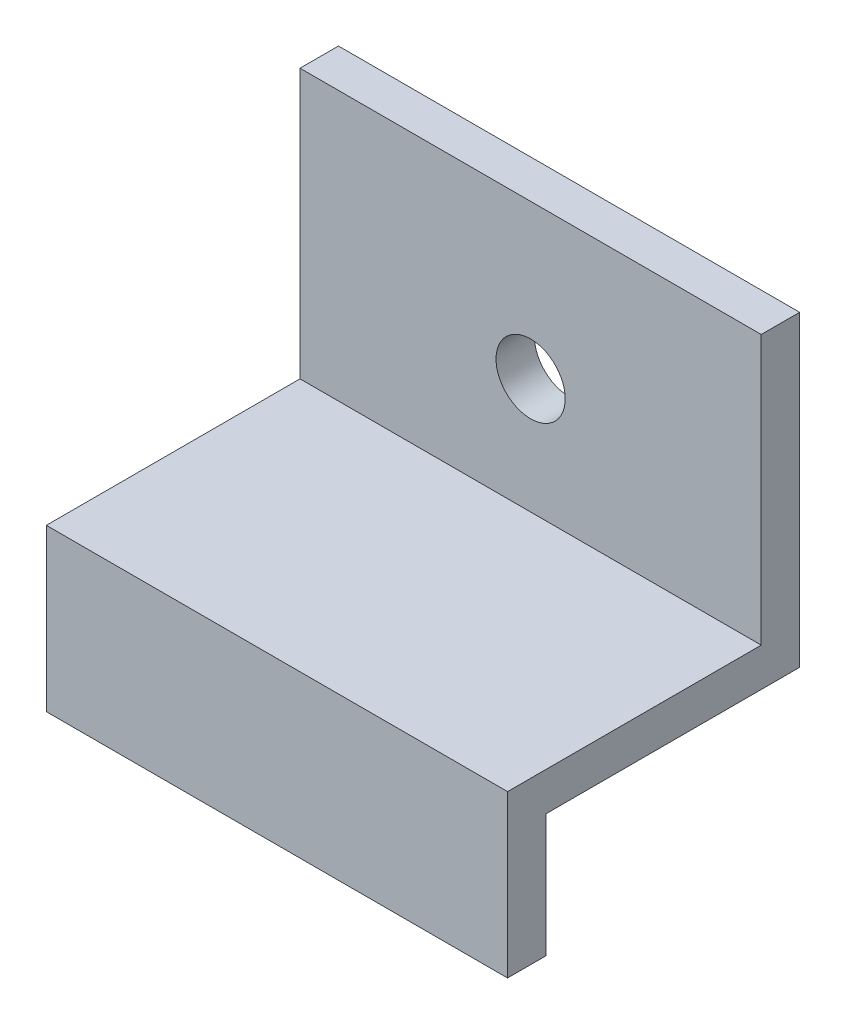
ISO-10303-21;
HEADER;
FILE_DESCRIPTION(('STEP AP214'),'2;1');
FILE_NAME('part.step','',(''),(''),'','','');
FILE_SCHEMA(('AUTOMOTIVE_DESIGN { 1 0 10303 214 1 1 1 1 }'));
ENDSEC;
DATA;
#1=APPLICATION_CONTEXT('core data for automotive mechanical design processes');
#2=APPLICATION_PROTOCOL_DEFINITION('international standard','automotive_design',2000,#1);
#3=PRODUCT_CONTEXT('',#1,'mechanical');
#4=PRODUCT('Part','Part','',(#3));
#5=PRODUCT_RELATED_PRODUCT_CATEGORY('part','',(#4));
#6=PRODUCT_DEFINITION_FORMATION('','',#4);
#7=PRODUCT_DEFINITION_CONTEXT('part definition',#1,'design');
#8=PRODUCT_DEFINITION('design','',#6,#7);
#9=PRODUCT_DEFINITION_SHAPE('','',#8);
#10=(LENGTH_UNIT() NAMED_UNIT(*) SI_UNIT(.MILLI.,.METRE.));
#11=(NAMED_UNIT(*) PLANE_ANGLE_UNIT() SI_UNIT($,.RADIAN.));
#12=(NAMED_UNIT(*) SI_UNIT($,.STERADIAN.) SOLID_ANGLE_UNIT());
#13=UNCERTAINTY_MEASURE_WITH_UNIT(LENGTH_MEASURE(1.E-05),#10,'distance_accuracy_value','');
#14=(GEOMETRIC_REPRESENTATION_CONTEXT(3) GLOBAL_UNCERTAINTY_ASSIGNED_CONTEXT((#13)) GLOBAL_UNIT_ASSIGNED_CONTEXT((#10,
#11,#12)) REPRESENTATION_CONTEXT('',''));
#15=CARTESIAN_POINT('',(0.,0.,0.));
#16=DIRECTION('',(0.,0.,1.));
#17=DIRECTION('',(1.,0.,0.));
#18=AXIS2_PLACEMENT_3D('',#15,#16,#17);
#19=CARTESIAN_POINT('',(-30.00000000005,46.,4.274625098333E-10));
#20=DIRECTION('',(0.,-1.,0.));
#21=DIRECTION('',(-1.,0.,0.));
#22=AXIS2_PLACEMENT_3D('',#19,#20,#21);
#23=PLANE('',#22);
#24=DIRECTION('',(1.,0.,-4.806710585115E-13));
#25=VECTOR('',#24,1.);
#26=CARTESIAN_POINT('',(-30.00000000005,46.,4.274625098333E-10));
#27=LINE('',#26,#25);
#28=CARTESIAN_POINT('',(-30.00000000005,46.,4.274625098333E-10));
#29=VERTEX_POINT('',#28);
#30=CARTESIAN_POINT('',(30.000000000126,46.,-4.029061528854E-10));
#31=VERTEX_POINT('',#30);
#32=EDGE_CURVE('E11',#29,#31,#27,.T.);
#33=ORIENTED_EDGE('',*,*,#32,.F.);
#34=DIRECTION('',(4.806710585115E-13,0.,1.));
#35=VECTOR('',#34,1.);
#36=CARTESIAN_POINT('',(-30.00000000005,46.,4.274625098333E-10));
#37=LINE('',#36,#35);
#38=CARTESIAN_POINT('',(-29.99999999994,46.,4.999999999994));
#39=VERTEX_POINT('',#38);
#40=EDGE_CURVE('E112',#29,#39,#37,.T.);
#41=ORIENTED_EDGE('',*,*,#40,.T.);
#42=DIRECTION('',(1.,0.,-4.806710585115E-13));
#43=VECTOR('',#42,1.);
#44=CARTESIAN_POINT('',(-29.99999999994,46.,4.999999999995));
#45=LINE('',#44,#43);
#46=CARTESIAN_POINT('',(29.99999999997,46.,5.000000000129));
#47=VERTEX_POINT('',#46);
#48=EDGE_CURVE('E162',#39,#47,#45,.T.);
#49=ORIENTED_EDGE('',*,*,#48,.T.);
#50=DIRECTION('',(4.806710585115E-13,0.,1.));
#51=VECTOR('',#50,1.);
#52=CARTESIAN_POINT('',(30.000000000126,46.,-4.033609002363E-10));
#53=LINE('',#52,#51);
#54=EDGE_CURVE('E113',#31,#47,#53,.T.);
#55=ORIENTED_EDGE('',*,*,#54,.F.);
#56=EDGE_LOOP('',(#33,#41,#49,#55));
#57=FACE_BOUND('',#56,.T.);
#58=ADVANCED_FACE('F17',(#57),#23,.F.);
#59=CARTESIAN_POINT('',(-30.00000000005,46.,4.274625098333E-10));
#60=DIRECTION('',(4.806710585115E-13,0.,1.));
#61=DIRECTION('',(1.,0.,-4.806710585115E-13));
#62=AXIS2_PLACEMENT_3D('',#59,#60,#61);
#63=PLANE('',#62);
#64=CARTESIAN_POINT('',(2.149818101316E-10,26.,-4.579305823427E-10));
#65=DIRECTION('',(4.806710585115E-13,0.,1.));
#66=DIRECTION('',(1.,0.,-4.806710585115E-13));
#67=AXIS2_PLACEMENT_3D('',#64,#65,#66);
#68=CIRCLE('',#67,4.5);
#69=CARTESIAN_POINT('',(4.499999999965,26.,4.711182555184E-10));
#70=VERTEX_POINT('',#69);
#71=EDGE_CURVE('E142',#70,#70,#68,.T.);
#72=ORIENTED_EDGE('',*,*,#71,.T.);
#73=EDGE_LOOP('',(#72));
#74=FACE_BOUND('',#73,.T.);
#75=DIRECTION('',(0.,-1.,0.));
#76=VECTOR('',#75,1.);
#77=CARTESIAN_POINT('',(-30.00000000005,46.,4.274625098333E-10));
#78=LINE('',#77,#76);
#79=CARTESIAN_POINT('',(-30.00000000005,6.,4.274625098333E-10));
#80=VERTEX_POINT('',#79);
#81=EDGE_CURVE('E116',#29,#80,#78,.T.);
#82=ORIENTED_EDGE('',*,*,#81,.F.);
#83=ORIENTED_EDGE('',*,*,#32,.T.);
#84=DIRECTION('',(0.,-1.,0.));
#85=VECTOR('',#84,1.);
#86=CARTESIAN_POINT('',(30.000000000126,46.,-4.033609002363E-10));
#87=LINE('',#86,#85);
#88=CARTESIAN_POINT('',(30.000000000126,6.,-4.029061528854E-10));
#89=VERTEX_POINT('',#88);
#90=EDGE_CURVE('E179',#31,#89,#87,.T.);
#91=ORIENTED_EDGE('',*,*,#90,.T.);
#92=DIRECTION('',(1.,0.,-4.806710585115E-13));
#93=VECTOR('',#92,1.);
#94=CARTESIAN_POINT('',(-30.00000000005,6.,4.274625098333E-10));
#95=LINE('',#94,#93);
#96=EDGE_CURVE('E20',#80,#89,#95,.T.);
#97=ORIENTED_EDGE('',*,*,#96,.F.);
#98=EDGE_LOOP('',(#82,#83,#91,#97));
#99=FACE_BOUND('',#98,.T.);
#100=ADVANCED_FACE('F117',(#74,#99),#63,.F.);
#101=CARTESIAN_POINT('',(-30.00000000005,6.,4.273488229956E-10));
#102=DIRECTION('',(0.,-1.,0.));
#103=DIRECTION('',(-1.,0.,0.));
#104=AXIS2_PLACEMENT_3D('',#101,#102,#103);
#105=PLANE('',#104);
#106=DIRECTION('',(6.57315868402E-12,0.,-1.));
#107=VECTOR('',#106,1.);
#108=CARTESIAN_POINT('',(29.999999999909,6.,33.000000000452));
#109=LINE('',#108,#107);
#110=CARTESIAN_POINT('',(29.999999999909,6.,33.000000000452));
#111=VERTEX_POINT('',#110);
#112=EDGE_CURVE('E139',#111,#89,#109,.T.);
#113=ORIENTED_EDGE('',*,*,#112,.F.);
#114=DIRECTION('',(1.,0.,-4.806710585115E-13));
#115=VECTOR('',#114,1.);
#116=CARTESIAN_POINT('',(-30.00000000001,6.,33.000000000317));
#117=LINE('',#116,#115);
#118=CARTESIAN_POINT('',(-30.00000000001,6.,33.000000000317));
#119=VERTEX_POINT('',#118);
#120=EDGE_CURVE('E205',#119,#111,#117,.T.);
#121=ORIENTED_EDGE('',*,*,#120,.F.);
#122=DIRECTION('',(-1.260852533491E-12,0.,-1.));
#123=VECTOR('',#122,1.);
#124=CARTESIAN_POINT('',(-30.00000000001,6.,33.000000000317));
#125=LINE('',#124,#123);
#126=EDGE_CURVE('E121',#119,#80,#125,.T.);
#127=ORIENTED_EDGE('',*,*,#126,.T.);
#128=ORIENTED_EDGE('',*,*,#96,.T.);
#129=EDGE_LOOP('',(#113,#121,#127,#128));
#130=FACE_BOUND('',#129,.T.);
#131=ADVANCED_FACE('F272',(#130),#105,.T.);
#132=CARTESIAN_POINT('',(-30.00000000001,11.,33.000000000317));
#133=DIRECTION('',(4.806710585115E-13,0.,1.));
#134=DIRECTION('',(1.,0.,-4.806710585115E-13));
#135=AXIS2_PLACEMENT_3D('',#132,#133,#134);
#136=PLANE('',#135);
#137=DIRECTION('',(0.,-1.,0.));
#138=VECTOR('',#137,1.);
#139=CARTESIAN_POINT('',(-30.00000000001,11.,33.000000000317));
#140=LINE('',#139,#138);
#141=CARTESIAN_POINT('',(-30.00000000001,-10.,33.000000000317));
#142=VERTEX_POINT('',#141);
#143=EDGE_CURVE('E149',#119,#142,#140,.T.);
#144=ORIENTED_EDGE('',*,*,#143,.F.);
#145=ORIENTED_EDGE('',*,*,#120,.T.);
#146=DIRECTION('',(0.,-1.,0.));
#147=VECTOR('',#146,1.);
#148=CARTESIAN_POINT('',(29.999999999909,11.,33.000000000452));
#149=LINE('',#148,#147);
#150=CARTESIAN_POINT('',(29.999999999909,-10.,33.000000000452));
#151=VERTEX_POINT('',#150);
#152=EDGE_CURVE('E137',#111,#151,#149,.T.);
#153=ORIENTED_EDGE('',*,*,#152,.T.);
#154=DIRECTION('',(1.,0.,-4.806710585115E-13));
#155=VECTOR('',#154,1.);
#156=CARTESIAN_POINT('',(-30.00000000001,-10.,33.000000000317));
#157=LINE('',#156,#155);
#158=EDGE_CURVE('E191',#142,#151,#157,.T.);
#159=ORIENTED_EDGE('',*,*,#158,.F.);
#160=EDGE_LOOP('',(#144,#145,#153,#159));
#161=FACE_BOUND('',#160,.T.);
#162=ADVANCED_FACE('F258',(#161),#136,.F.);
#163=CARTESIAN_POINT('',(-30.00000000001,-10.,33.000000000317));
#164=DIRECTION('',(0.,-1.,0.));
#165=DIRECTION('',(-1.,0.,0.));
#166=AXIS2_PLACEMENT_3D('',#163,#164,#165);
#167=PLANE('',#166);
#168=DIRECTION('',(4.806710585115E-13,0.,1.));
#169=VECTOR('',#168,1.);
#170=CARTESIAN_POINT('',(29.999999999909,-10.,33.000000000452));
#171=LINE('',#170,#169);
#172=CARTESIAN_POINT('',(30.000000000012,-10.,38.000000000019));
#173=VERTEX_POINT('',#172);
#174=EDGE_CURVE('E140',#151,#173,#171,.T.);
#175=ORIENTED_EDGE('',*,*,#174,.T.);
#176=DIRECTION('',(1.,0.,-4.806710585115E-13));
#177=VECTOR('',#176,1.);
#178=CARTESIAN_POINT('',(-29.9999999999,-10.,37.999999999884));
#179=LINE('',#178,#177);
#180=CARTESIAN_POINT('',(-29.9999999999,-10.,37.999999999884));
#181=VERTEX_POINT('',#180);
#182=EDGE_CURVE('E188',#181,#173,#179,.T.);
#183=ORIENTED_EDGE('',*,*,#182,.F.);
#184=DIRECTION('',(4.806710585115E-13,0.,1.));
#185=VECTOR('',#184,1.);
#186=CARTESIAN_POINT('',(-30.00000000001,-10.,33.000000000317));
#187=LINE('',#186,#185);
#188=EDGE_CURVE('E152',#142,#181,#187,.T.);
#189=ORIENTED_EDGE('',*,*,#188,.F.);
#190=ORIENTED_EDGE('',*,*,#158,.T.);
#191=EDGE_LOOP('',(#175,#183,#189,#190));
#192=FACE_BOUND('',#191,.T.);
#193=ADVANCED_FACE('F253',(#192),#167,.T.);
#194=CARTESIAN_POINT('',(-29.9999999999,11.,37.999999999884));
#195=DIRECTION('',(4.806710585115E-13,0.,1.));
#196=DIRECTION('',(1.,0.,-4.806710585115E-13));
#197=AXIS2_PLACEMENT_3D('',#194,#195,#196);
#198=PLANE('',#197);
#199=ORIENTED_EDGE('',*,*,#182,.T.);
#200=DIRECTION('',(0.,1.,0.));
#201=VECTOR('',#200,1.);
#202=CARTESIAN_POINT('',(30.000000000012,-10.,38.000000000019));
#203=LINE('',#202,#201);
#204=CARTESIAN_POINT('',(30.000000000012,11.,38.000000000019));
#205=VERTEX_POINT('',#204);
#206=EDGE_CURVE('E187',#173,#205,#203,.T.);
#207=ORIENTED_EDGE('',*,*,#206,.T.);
#208=DIRECTION('',(1.,0.,-4.806710585115E-13));
#209=VECTOR('',#208,1.);
#210=CARTESIAN_POINT('',(-29.9999999999,11.,37.999999999884));
#211=LINE('',#210,#209);
#212=CARTESIAN_POINT('',(-29.9999999999,11.,37.999999999884));
#213=VERTEX_POINT('',#212);
#214=EDGE_CURVE('E192',#213,#205,#211,.T.);
#215=ORIENTED_EDGE('',*,*,#214,.F.);
#216=DIRECTION('',(0.,-1.,0.));
#217=VECTOR('',#216,1.);
#218=CARTESIAN_POINT('',(-29.9999999999,11.,37.999999999884));
#219=LINE('',#218,#217);
#220=EDGE_CURVE('E157',#213,#181,#219,.T.);
#221=ORIENTED_EDGE('',*,*,#220,.T.);
#222=EDGE_LOOP('',(#199,#207,#215,#221));
#223=FACE_BOUND('',#222,.T.);
#224=ADVANCED_FACE('F241',(#223),#198,.T.);
#225=CARTESIAN_POINT('',(-29.99999999994,11.,4.999999999994));
#226=DIRECTION('',(0.,-1.,0.));
#227=DIRECTION('',(-1.,0.,0.));
#228=AXIS2_PLACEMENT_3D('',#225,#226,#227);
#229=PLANE('',#228);
#230=DIRECTION('',(1.,0.,-4.806710585115E-13));
#231=VECTOR('',#230,1.);
#232=CARTESIAN_POINT('',(-29.99999999994,11.,4.999999999995));
#233=LINE('',#232,#231);
#234=CARTESIAN_POINT('',(-29.99999999994,11.,4.999999999994));
#235=VERTEX_POINT('',#234);
#236=CARTESIAN_POINT('',(29.99999999997,11.,5.000000000129));
#237=VERTEX_POINT('',#236);
#238=EDGE_CURVE('E163',#235,#237,#233,.T.);
#239=ORIENTED_EDGE('',*,*,#238,.F.);
#240=DIRECTION('',(1.267763671819E-12,0.,1.));
#241=VECTOR('',#240,1.);
#242=CARTESIAN_POINT('',(-29.99999999994,11.,4.999999999994));
#243=LINE('',#242,#241);
#244=EDGE_CURVE('E135',#235,#213,#243,.T.);
#245=ORIENTED_EDGE('',*,*,#244,.T.);
#246=ORIENTED_EDGE('',*,*,#214,.T.);
#247=DIRECTION('',(1.260852533491E-12,0.,1.));
#248=VECTOR('',#247,1.);
#249=CARTESIAN_POINT('',(29.99999999997,11.,5.000000000129));
#250=LINE('',#249,#248);
#251=EDGE_CURVE('E145',#237,#205,#250,.T.);
#252=ORIENTED_EDGE('',*,*,#251,.F.);
#253=EDGE_LOOP('',(#239,#245,#246,#252));
#254=FACE_BOUND('',#253,.T.);
#255=ADVANCED_FACE('F235',(#254),#229,.F.);
#256=CARTESIAN_POINT('',(30.000000000126,46.,-4.033609002363E-10));
#257=DIRECTION('',(1.,0.,-4.806988140871E-13));
#258=DIRECTION('',(-4.806988140871E-13,0.,-1.));
#259=AXIS2_PLACEMENT_3D('',#256,#257,#258);
#260=PLANE('',#259);
#261=DIRECTION('',(0.,-1.,0.));
#262=VECTOR('',#261,1.);
#263=CARTESIAN_POINT('',(29.99999999997,46.,5.000000000129));
#264=LINE('',#263,#262);
#265=EDGE_CURVE('E158',#47,#237,#264,.T.);
#266=ORIENTED_EDGE('',*,*,#265,.T.);
#267=ORIENTED_EDGE('',*,*,#251,.T.);
#268=ORIENTED_EDGE('',*,*,#206,.F.);
#269=ORIENTED_EDGE('',*,*,#174,.F.);
#270=ORIENTED_EDGE('',*,*,#152,.F.);
#271=ORIENTED_EDGE('',*,*,#112,.T.);
#272=ORIENTED_EDGE('',*,*,#90,.F.);
#273=ORIENTED_EDGE('',*,*,#54,.T.);
#274=EDGE_LOOP('',(#266,#267,#268,#269,#270,#271,#272,#273));
#275=FACE_BOUND('',#274,.T.);
#276=ADVANCED_FACE('F240',(#275),#260,.T.);
#277=CARTESIAN_POINT('',(9.958966984414E-11,26.,-0.01000000021622));
#278=DIRECTION('',(-4.806710585115E-13,0.,-1.));
#279=DIRECTION('',(1.,0.,-4.806710585115E-13));
#280=AXIS2_PLACEMENT_3D('',#277,#278,#279);
#281=CYLINDRICAL_SURFACE('',#280,4.5);
#282=DIRECTION('',(4.806710585115E-13,0.,1.));
#283=VECTOR('',#282,1.);
#284=CARTESIAN_POINT('',(4.500000000109,26.,-0.01000000025442));
#285=LINE('',#284,#283);
#286=CARTESIAN_POINT('',(4.500000000069,26.,5.000000000038));
#287=VERTEX_POINT('',#286);
#288=EDGE_CURVE('E146',#70,#287,#285,.T.);
#289=ORIENTED_EDGE('',*,*,#288,.T.);
#290=CARTESIAN_POINT('',(5.911715561524E-11,26.,5.000000000075));
#291=DIRECTION('',(4.806710585115E-13,0.,1.));
#292=DIRECTION('',(1.,0.,-4.806710585115E-13));
#293=AXIS2_PLACEMENT_3D('',#290,#291,#292);
#294=CIRCLE('',#293,4.5);
#295=EDGE_CURVE('E167',#287,#287,#294,.T.);
#296=ORIENTED_EDGE('',*,*,#295,.T.);
#297=ORIENTED_EDGE('',*,*,#288,.F.);
#298=ORIENTED_EDGE('',*,*,#71,.F.);
#299=EDGE_LOOP('',(#289,#296,#297,#298));
#300=FACE_BOUND('',#299,.T.);
#301=ADVANCED_FACE('F230',(#300),#281,.F.);
#302=CARTESIAN_POINT('',(-29.99999999994,46.,4.999999999995));
#303=DIRECTION('',(4.806710585115E-13,0.,1.));
#304=DIRECTION('',(1.,0.,-4.806710585115E-13));
#305=AXIS2_PLACEMENT_3D('',#302,#303,#304);
#306=PLANE('',#305);
#307=ORIENTED_EDGE('',*,*,#295,.F.);
#308=EDGE_LOOP('',(#307));
#309=FACE_BOUND('',#308,.T.);
#310=ORIENTED_EDGE('',*,*,#238,.T.);
#311=ORIENTED_EDGE('',*,*,#265,.F.);
#312=ORIENTED_EDGE('',*,*,#48,.F.);
#313=DIRECTION('',(0.,-1.,0.));
#314=VECTOR('',#313,1.);
#315=CARTESIAN_POINT('',(-29.99999999994,46.,4.999999999995));
#316=LINE('',#315,#314);
#317=EDGE_CURVE('E127',#39,#235,#316,.T.);
#318=ORIENTED_EDGE('',*,*,#317,.T.);
#319=EDGE_LOOP('',(#310,#311,#312,#318));
#320=FACE_BOUND('',#319,.T.);
#321=ADVANCED_FACE('F222',(#309,#320),#306,.T.);
#322=CARTESIAN_POINT('',(-30.00000000005,46.,4.274625098333E-10));
#323=DIRECTION('',(1.,0.,-4.806988140871E-13));
#324=DIRECTION('',(-4.806988140871E-13,0.,-1.));
#325=AXIS2_PLACEMENT_3D('',#322,#323,#324);
#326=PLANE('',#325);
#327=ORIENTED_EDGE('',*,*,#40,.F.);
#328=ORIENTED_EDGE('',*,*,#81,.T.);
#329=ORIENTED_EDGE('',*,*,#126,.F.);
#330=ORIENTED_EDGE('',*,*,#143,.T.);
#331=ORIENTED_EDGE('',*,*,#188,.T.);
#332=ORIENTED_EDGE('',*,*,#220,.F.);
#333=ORIENTED_EDGE('',*,*,#244,.F.);
#334=ORIENTED_EDGE('',*,*,#317,.F.);
#335=EDGE_LOOP('',(#327,#328,#329,#330,#331,#332,#333,#334));
#336=FACE_BOUND('',#335,.T.);
#337=ADVANCED_FACE('F124',(#336),#326,.F.);
#338=CLOSED_SHELL('',(#58,#100,#131,#162,#193,#224,#255,#276,#301,#321,#337));
#339=MANIFOLD_SOLID_BREP('B1',#338);
#340=ADVANCED_BREP_SHAPE_REPRESENTATION('',(#18,#339),#14);
#341=SHAPE_DEFINITION_REPRESENTATION(#9,#340);
ENDSEC;
END-ISO-10303-21;
